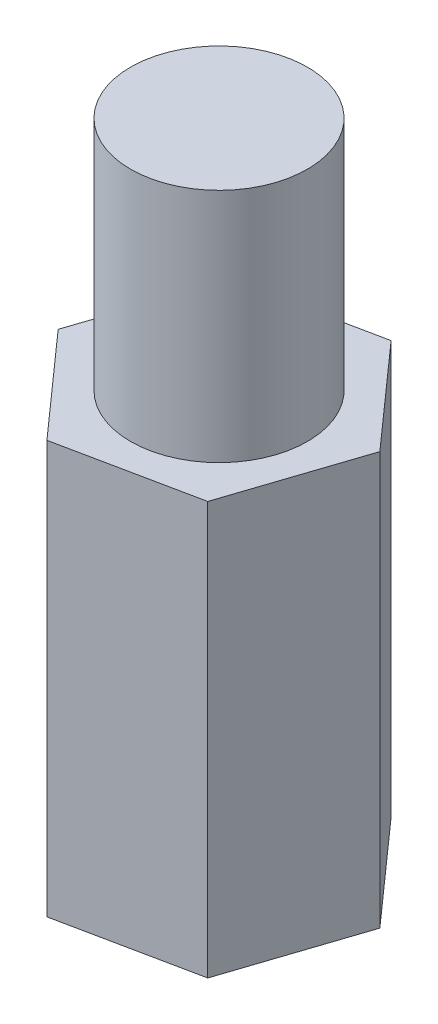
ISO-10303-21;
HEADER;
FILE_DESCRIPTION(('STEP AP214'),'2;1');
FILE_NAME('part.step','',(''),(''),'','','');
FILE_SCHEMA(('AUTOMOTIVE_DESIGN { 1 0 10303 214 1 1 1 1 }'));
ENDSEC;
DATA;
#1=APPLICATION_CONTEXT('core data for automotive mechanical design processes');
#2=APPLICATION_PROTOCOL_DEFINITION('international standard','automotive_design',2000,#1);
#3=PRODUCT_CONTEXT('',#1,'mechanical');
#4=PRODUCT('Part','Part','',(#3));
#5=PRODUCT_RELATED_PRODUCT_CATEGORY('part','',(#4));
#6=PRODUCT_DEFINITION_FORMATION('','',#4);
#7=PRODUCT_DEFINITION_CONTEXT('part definition',#1,'design');
#8=PRODUCT_DEFINITION('design','',#6,#7);
#9=PRODUCT_DEFINITION_SHAPE('','',#8);
#10=(LENGTH_UNIT() NAMED_UNIT(*) SI_UNIT(.MILLI.,.METRE.));
#11=(NAMED_UNIT(*) PLANE_ANGLE_UNIT() SI_UNIT($,.RADIAN.));
#12=(NAMED_UNIT(*) SI_UNIT($,.STERADIAN.) SOLID_ANGLE_UNIT());
#13=UNCERTAINTY_MEASURE_WITH_UNIT(LENGTH_MEASURE(1.E-05),#10,'distance_accuracy_value','');
#14=(GEOMETRIC_REPRESENTATION_CONTEXT(3) GLOBAL_UNCERTAINTY_ASSIGNED_CONTEXT((#13)) GLOBAL_UNIT_ASSIGNED_CONTEXT((#10,
#11,#12)) REPRESENTATION_CONTEXT('',''));
#15=CARTESIAN_POINT('',(0.,0.,0.));
#16=DIRECTION('',(0.,0.,1.));
#17=DIRECTION('',(1.,0.,0.));
#18=AXIS2_PLACEMENT_3D('',#15,#16,#17);
#19=CARTESIAN_POINT('',(0.,4.,0.));
#20=DIRECTION('',(0.,-1.,0.));
#21=DIRECTION('',(0.,0.,-1.));
#22=AXIS2_PLACEMENT_3D('',#19,#20,#21);
#23=CYLINDRICAL_SURFACE('',#22,1.5);
#24=CARTESIAN_POINT('',(0.,4.,0.));
#25=DIRECTION('',(0.,1.,0.));
#26=DIRECTION('',(0.,0.,1.));
#27=AXIS2_PLACEMENT_3D('',#24,#25,#26);
#28=CIRCLE('',#27,1.5);
#29=CARTESIAN_POINT('',(0.,4.,1.5));
#30=VERTEX_POINT('',#29);
#31=EDGE_CURVE('E11',#30,#30,#28,.T.);
#32=ORIENTED_EDGE('',*,*,#31,.F.);
#33=EDGE_LOOP('',(#32));
#34=FACE_BOUND('',#33,.T.);
#35=CARTESIAN_POINT('',(0.,0.,0.));
#36=DIRECTION('',(0.,1.,0.));
#37=DIRECTION('',(0.,0.,1.));
#38=AXIS2_PLACEMENT_3D('',#35,#36,#37);
#39=CIRCLE('',#38,1.5);
#40=CARTESIAN_POINT('',(0.,0.,1.5));
#41=VERTEX_POINT('',#40);
#42=EDGE_CURVE('E35',#41,#41,#39,.T.);
#43=ORIENTED_EDGE('',*,*,#42,.T.);
#44=EDGE_LOOP('',(#43));
#45=FACE_BOUND('',#44,.T.);
#46=ADVANCED_FACE('F32',(#34,#45),#23,.T.);
#47=CARTESIAN_POINT('',(0.,4.,0.));
#48=DIRECTION('',(0.,1.,0.));
#49=DIRECTION('',(0.,0.,1.));
#50=AXIS2_PLACEMENT_3D('',#47,#48,#49);
#51=PLANE('',#50);
#52=ORIENTED_EDGE('',*,*,#31,.T.);
#53=EDGE_LOOP('',(#52));
#54=FACE_BOUND('',#53,.T.);
#55=ADVANCED_FACE('F154',(#54),#51,.T.);
#56=CARTESIAN_POINT('',(-0.72718093857044,-7.,2.19192637100637));
#57=DIRECTION('',(0.201873128165222,0.,0.979411680614841));
#58=DIRECTION('',(0.979411680614841,0.,-0.201873128165222));
#59=AXIS2_PLACEMENT_3D('',#56,#57,#58);
#60=PLANE('',#59);
#61=DIRECTION('',(0.979411680614841,0.,-0.201873128165222));
#62=VECTOR('',#61,1.);
#63=CARTESIAN_POINT('',(-0.72718093857044,0.,2.19192637100637));
#64=LINE('',#63,#62);
#65=CARTESIAN_POINT('',(-0.72718093857044,0.,2.19192637100637));
#66=VERTEX_POINT('',#65);
#67=CARTESIAN_POINT('',(1.53467345123133,0.,1.725720351453));
#68=VERTEX_POINT('',#67);
#69=EDGE_CURVE('E119',#66,#68,#64,.T.);
#70=ORIENTED_EDGE('',*,*,#69,.F.);
#71=DIRECTION('',(0.,1.,0.));
#72=VECTOR('',#71,1.);
#73=CARTESIAN_POINT('',(-0.72718093857044,-7.,2.19192637100637));
#74=LINE('',#73,#72);
#75=CARTESIAN_POINT('',(-0.72718093857044,-7.,2.19192637100637));
#76=VERTEX_POINT('',#75);
#77=EDGE_CURVE('E48',#76,#66,#74,.T.);
#78=ORIENTED_EDGE('',*,*,#77,.F.);
#79=DIRECTION('',(0.979411680614841,0.,-0.201873128165222));
#80=VECTOR('',#79,1.);
#81=CARTESIAN_POINT('',(-0.72718093857044,-7.,2.19192637100637));
#82=LINE('',#81,#80);
#83=CARTESIAN_POINT('',(1.53467345123133,-7.,1.725720351453));
#84=VERTEX_POINT('',#83);
#85=EDGE_CURVE('E135',#76,#84,#82,.T.);
#86=ORIENTED_EDGE('',*,*,#85,.T.);
#87=DIRECTION('',(0.,1.,0.));
#88=VECTOR('',#87,1.);
#89=CARTESIAN_POINT('',(1.53467345123133,-7.,1.725720351453));
#90=LINE('',#89,#88);
#91=EDGE_CURVE('E83',#84,#68,#90,.T.);
#92=ORIENTED_EDGE('',*,*,#91,.T.);
#93=EDGE_LOOP('',(#70,#78,#86,#92));
#94=FACE_BOUND('',#93,.T.);
#95=ADVANCED_FACE('F141',(#94),#60,.T.);
#96=CARTESIAN_POINT('',(-2.26185438980177,-7.,0.46620601955337));
#97=DIRECTION('',(-0.747258832093053,0.,0.664533097639935));
#98=DIRECTION('',(0.664533097639935,0.,0.747258832093053));
#99=AXIS2_PLACEMENT_3D('',#96,#97,#98);
#100=PLANE('',#99);
#101=DIRECTION('',(0.664533097639935,0.,0.747258832093053));
#102=VECTOR('',#101,1.);
#103=CARTESIAN_POINT('',(-2.26185438980177,0.,0.46620601955337));
#104=LINE('',#103,#102);
#105=CARTESIAN_POINT('',(-2.26185438980177,0.,0.46620601955337));
#106=VERTEX_POINT('',#105);
#107=EDGE_CURVE('E132',#106,#66,#104,.T.);
#108=ORIENTED_EDGE('',*,*,#107,.F.);
#109=DIRECTION('',(0.,1.,0.));
#110=VECTOR('',#109,1.);
#111=CARTESIAN_POINT('',(-2.26185438980177,-7.,0.46620601955337));
#112=LINE('',#111,#110);
#113=CARTESIAN_POINT('',(-2.26185438980177,-7.,0.46620601955337));
#114=VERTEX_POINT('',#113);
#115=EDGE_CURVE('E71',#114,#106,#112,.T.);
#116=ORIENTED_EDGE('',*,*,#115,.F.);
#117=DIRECTION('',(0.664533097639935,0.,0.747258832093053));
#118=VECTOR('',#117,1.);
#119=CARTESIAN_POINT('',(-2.26185438980177,-7.,0.46620601955337));
#120=LINE('',#119,#118);
#121=EDGE_CURVE('E109',#114,#76,#120,.T.);
#122=ORIENTED_EDGE('',*,*,#121,.T.);
#123=ORIENTED_EDGE('',*,*,#77,.T.);
#124=EDGE_LOOP('',(#108,#116,#122,#123));
#125=FACE_BOUND('',#124,.T.);
#126=ADVANCED_FACE('F146',(#125),#100,.T.);
#127=CARTESIAN_POINT('',(-1.53467345123133,-7.,-1.725720351453));
#128=DIRECTION('',(-0.949131960258275,0.,-0.314878582974907));
#129=DIRECTION('',(-0.314878582974907,0.,0.949131960258275));
#130=AXIS2_PLACEMENT_3D('',#127,#128,#129);
#131=PLANE('',#130);
#132=DIRECTION('',(-0.314878582974907,0.,0.949131960258275));
#133=VECTOR('',#132,1.);
#134=CARTESIAN_POINT('',(-1.53467345123133,0.,-1.725720351453));
#135=LINE('',#134,#133);
#136=CARTESIAN_POINT('',(-1.53467345123133,0.,-1.725720351453));
#137=VERTEX_POINT('',#136);
#138=EDGE_CURVE('E96',#137,#106,#135,.T.);
#139=ORIENTED_EDGE('',*,*,#138,.F.);
#140=DIRECTION('',(0.,1.,0.));
#141=VECTOR('',#140,1.);
#142=CARTESIAN_POINT('',(-1.53467345123133,-7.,-1.725720351453));
#143=LINE('',#142,#141);
#144=CARTESIAN_POINT('',(-1.53467345123133,-7.,-1.725720351453));
#145=VERTEX_POINT('',#144);
#146=EDGE_CURVE('E91',#145,#137,#143,.T.);
#147=ORIENTED_EDGE('',*,*,#146,.F.);
#148=DIRECTION('',(-0.314878582974907,0.,0.949131960258275));
#149=VECTOR('',#148,1.);
#150=CARTESIAN_POINT('',(-1.53467345123133,-7.,-1.725720351453));
#151=LINE('',#150,#149);
#152=EDGE_CURVE('E94',#145,#114,#151,.T.);
#153=ORIENTED_EDGE('',*,*,#152,.T.);
#154=ORIENTED_EDGE('',*,*,#115,.T.);
#155=EDGE_LOOP('',(#139,#147,#153,#154));
#156=FACE_BOUND('',#155,.T.);
#157=ADVANCED_FACE('F93',(#156),#131,.T.);
#158=CARTESIAN_POINT('',(0.727180938570441,-7.,-2.19192637100637));
#159=DIRECTION('',(-0.201873128165222,0.,-0.979411680614841));
#160=DIRECTION('',(-0.979411680614841,0.,0.201873128165222));
#161=AXIS2_PLACEMENT_3D('',#158,#159,#160);
#162=PLANE('',#161);
#163=DIRECTION('',(-0.979411680614841,0.,0.201873128165222));
#164=VECTOR('',#163,1.);
#165=CARTESIAN_POINT('',(0.727180938570441,0.,-2.19192637100637));
#166=LINE('',#165,#164);
#167=CARTESIAN_POINT('',(0.727180938570441,0.,-2.19192637100637));
#168=VERTEX_POINT('',#167);
#169=EDGE_CURVE('E129',#168,#137,#166,.T.);
#170=ORIENTED_EDGE('',*,*,#169,.F.);
#171=DIRECTION('',(0.,1.,0.));
#172=VECTOR('',#171,1.);
#173=CARTESIAN_POINT('',(0.727180938570441,-7.,-2.19192637100637));
#174=LINE('',#173,#172);
#175=CARTESIAN_POINT('',(0.727180938570441,-7.,-2.19192637100637));
#176=VERTEX_POINT('',#175);
#177=EDGE_CURVE('E101',#176,#168,#174,.T.);
#178=ORIENTED_EDGE('',*,*,#177,.F.);
#179=DIRECTION('',(-0.979411680614841,0.,0.201873128165222));
#180=VECTOR('',#179,1.);
#181=CARTESIAN_POINT('',(0.727180938570441,-7.,-2.19192637100637));
#182=LINE('',#181,#180);
#183=EDGE_CURVE('E107',#176,#145,#182,.T.);
#184=ORIENTED_EDGE('',*,*,#183,.T.);
#185=ORIENTED_EDGE('',*,*,#146,.T.);
#186=EDGE_LOOP('',(#170,#178,#184,#185));
#187=FACE_BOUND('',#186,.T.);
#188=ADVANCED_FACE('F111',(#187),#162,.T.);
#189=CARTESIAN_POINT('',(2.26185438980177,-7.,-0.466206019553371));
#190=DIRECTION('',(0.747258832093053,0.,-0.664533097639935));
#191=DIRECTION('',(-0.664533097639935,0.,-0.747258832093053));
#192=AXIS2_PLACEMENT_3D('',#189,#190,#191);
#193=PLANE('',#192);
#194=DIRECTION('',(-0.664533097639935,0.,-0.747258832093053));
#195=VECTOR('',#194,1.);
#196=CARTESIAN_POINT('',(2.26185438980177,0.,-0.466206019553371));
#197=LINE('',#196,#195);
#198=CARTESIAN_POINT('',(2.26185438980177,0.,-0.466206019553371));
#199=VERTEX_POINT('',#198);
#200=EDGE_CURVE('E126',#199,#168,#197,.T.);
#201=ORIENTED_EDGE('',*,*,#200,.F.);
#202=DIRECTION('',(0.,1.,0.));
#203=VECTOR('',#202,1.);
#204=CARTESIAN_POINT('',(2.26185438980177,-7.,-0.466206019553371));
#205=LINE('',#204,#203);
#206=CARTESIAN_POINT('',(2.26185438980177,-7.,-0.466206019553371));
#207=VERTEX_POINT('',#206);
#208=EDGE_CURVE('E139',#207,#199,#205,.T.);
#209=ORIENTED_EDGE('',*,*,#208,.F.);
#210=DIRECTION('',(-0.664533097639935,0.,-0.747258832093053));
#211=VECTOR('',#210,1.);
#212=CARTESIAN_POINT('',(2.26185438980177,-7.,-0.466206019553371));
#213=LINE('',#212,#211);
#214=EDGE_CURVE('E112',#207,#176,#213,.T.);
#215=ORIENTED_EDGE('',*,*,#214,.T.);
#216=ORIENTED_EDGE('',*,*,#177,.T.);
#217=EDGE_LOOP('',(#201,#209,#215,#216));
#218=FACE_BOUND('',#217,.T.);
#219=ADVANCED_FACE('F192',(#218),#193,.T.);
#220=CARTESIAN_POINT('',(1.53467345123133,-7.,1.725720351453));
#221=DIRECTION('',(0.949131960258275,0.,0.314878582974906));
#222=DIRECTION('',(0.314878582974906,0.,-0.949131960258275));
#223=AXIS2_PLACEMENT_3D('',#220,#221,#222);
#224=PLANE('',#223);
#225=DIRECTION('',(0.314878582974906,0.,-0.949131960258275));
#226=VECTOR('',#225,1.);
#227=CARTESIAN_POINT('',(1.53467345123133,0.,1.725720351453));
#228=LINE('',#227,#226);
#229=EDGE_CURVE('E122',#68,#199,#228,.T.);
#230=ORIENTED_EDGE('',*,*,#229,.F.);
#231=ORIENTED_EDGE('',*,*,#91,.F.);
#232=DIRECTION('',(0.314878582974906,0.,-0.949131960258275));
#233=VECTOR('',#232,1.);
#234=CARTESIAN_POINT('',(1.53467345123133,-7.,1.725720351453));
#235=LINE('',#234,#233);
#236=EDGE_CURVE('E114',#84,#207,#235,.T.);
#237=ORIENTED_EDGE('',*,*,#236,.T.);
#238=ORIENTED_EDGE('',*,*,#208,.T.);
#239=EDGE_LOOP('',(#230,#231,#237,#238));
#240=FACE_BOUND('',#239,.T.);
#241=ADVANCED_FACE('F142',(#240),#224,.T.);
#242=CARTESIAN_POINT('',(0.,-7.,0.));
#243=DIRECTION('',(0.,1.,0.));
#244=DIRECTION('',(0.,0.,1.));
#245=AXIS2_PLACEMENT_3D('',#242,#243,#244);
#246=PLANE('',#245);
#247=CARTESIAN_POINT('',(0.,-7.,0.));
#248=DIRECTION('',(0.,-1.,0.));
#249=DIRECTION('',(0.,0.,-1.));
#250=AXIS2_PLACEMENT_3D('',#247,#248,#249);
#251=CIRCLE('',#250,1.);
#252=CARTESIAN_POINT('',(0.,-7.,-1.));
#253=VERTEX_POINT('',#252);
#254=EDGE_CURVE('E186',#253,#253,#251,.T.);
#255=ORIENTED_EDGE('',*,*,#254,.F.);
#256=EDGE_LOOP('',(#255));
#257=FACE_BOUND('',#256,.T.);
#258=ORIENTED_EDGE('',*,*,#85,.F.);
#259=ORIENTED_EDGE('',*,*,#121,.F.);
#260=ORIENTED_EDGE('',*,*,#152,.F.);
#261=ORIENTED_EDGE('',*,*,#183,.F.);
#262=ORIENTED_EDGE('',*,*,#214,.F.);
#263=ORIENTED_EDGE('',*,*,#236,.F.);
#264=EDGE_LOOP('',(#258,#259,#260,#261,#262,#263));
#265=FACE_BOUND('',#264,.T.);
#266=ADVANCED_FACE('F105',(#257,#265),#246,.F.);
#267=CARTESIAN_POINT('',(0.,0.,0.));
#268=DIRECTION('',(0.,1.,0.));
#269=DIRECTION('',(0.,0.,1.));
#270=AXIS2_PLACEMENT_3D('',#267,#268,#269);
#271=PLANE('',#270);
#272=ORIENTED_EDGE('',*,*,#42,.F.);
#273=EDGE_LOOP('',(#272));
#274=FACE_BOUND('',#273,.T.);
#275=ORIENTED_EDGE('',*,*,#69,.T.);
#276=ORIENTED_EDGE('',*,*,#229,.T.);
#277=ORIENTED_EDGE('',*,*,#200,.T.);
#278=ORIENTED_EDGE('',*,*,#169,.T.);
#279=ORIENTED_EDGE('',*,*,#138,.T.);
#280=ORIENTED_EDGE('',*,*,#107,.T.);
#281=EDGE_LOOP('',(#275,#276,#277,#278,#279,#280));
#282=FACE_BOUND('',#281,.T.);
#283=ADVANCED_FACE('F145',(#274,#282),#271,.T.);
#284=CARTESIAN_POINT('',(0.,-3.,0.));
#285=DIRECTION('',(0.,-1.,0.));
#286=DIRECTION('',(0.,0.,-1.));
#287=AXIS2_PLACEMENT_3D('',#284,#285,#286);
#288=CYLINDRICAL_SURFACE('',#287,1.);
#289=CARTESIAN_POINT('',(0.,-3.,0.));
#290=DIRECTION('',(0.,-1.,0.));
#291=DIRECTION('',(0.,0.,-1.));
#292=AXIS2_PLACEMENT_3D('',#289,#290,#291);
#293=CIRCLE('',#292,1.);
#294=CARTESIAN_POINT('',(0.,-3.,-1.));
#295=VERTEX_POINT('',#294);
#296=EDGE_CURVE('E123',#295,#295,#293,.T.);
#297=ORIENTED_EDGE('',*,*,#296,.F.);
#298=EDGE_LOOP('',(#297));
#299=FACE_BOUND('',#298,.T.);
#300=ORIENTED_EDGE('',*,*,#254,.T.);
#301=EDGE_LOOP('',(#300));
#302=FACE_BOUND('',#301,.T.);
#303=ADVANCED_FACE('F169',(#299,#302),#288,.F.);
#304=CARTESIAN_POINT('',(0.,-3.,0.));
#305=DIRECTION('',(0.,-1.,0.));
#306=DIRECTION('',(0.,0.,-1.));
#307=AXIS2_PLACEMENT_3D('',#304,#305,#306);
#308=PLANE('',#307);
#309=ORIENTED_EDGE('',*,*,#296,.T.);
#310=EDGE_LOOP('',(#309));
#311=FACE_BOUND('',#310,.T.);
#312=ADVANCED_FACE('F174',(#311),#308,.T.);
#313=CLOSED_SHELL('',(#46,#55,#95,#126,#157,#188,#219,#241,#266,#283,#303,#312));
#314=MANIFOLD_SOLID_BREP('B2',#313);
#315=ADVANCED_BREP_SHAPE_REPRESENTATION('',(#18,#314),#14);
#316=SHAPE_DEFINITION_REPRESENTATION(#9,#315);
ENDSEC;
END-ISO-10303-21;
